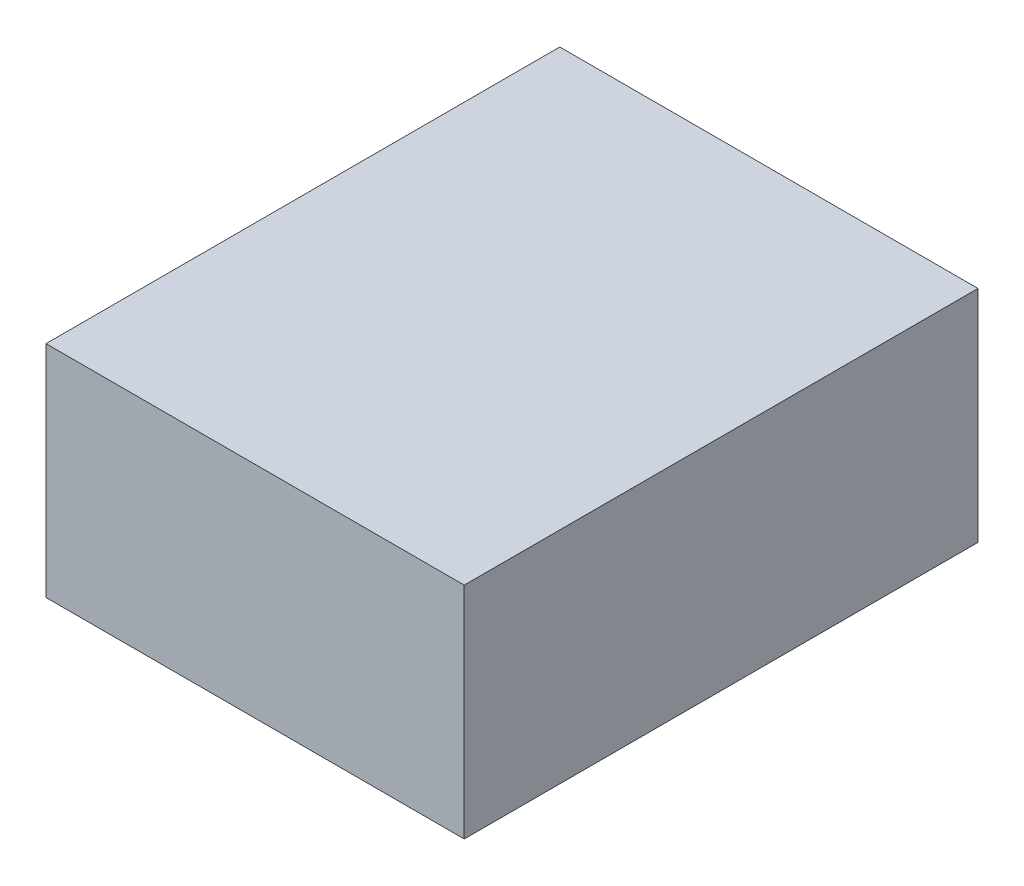
ISO-10303-21;
HEADER;
FILE_DESCRIPTION(('STEP AP214'),'2;1');
FILE_NAME('part.step','',(''),(''),'','','');
FILE_SCHEMA(('AUTOMOTIVE_DESIGN { 1 0 10303 214 1 1 1 1 }'));
ENDSEC;
DATA;
#1=APPLICATION_CONTEXT('core data for automotive mechanical design processes');
#2=APPLICATION_PROTOCOL_DEFINITION('international standard','automotive_design',2000,#1);
#3=PRODUCT_CONTEXT('',#1,'mechanical');
#4=PRODUCT('Part','Part','',(#3));
#5=PRODUCT_RELATED_PRODUCT_CATEGORY('part','',(#4));
#6=PRODUCT_DEFINITION_FORMATION('','',#4);
#7=PRODUCT_DEFINITION_CONTEXT('part definition',#1,'design');
#8=PRODUCT_DEFINITION('design','',#6,#7);
#9=PRODUCT_DEFINITION_SHAPE('','',#8);
#10=(LENGTH_UNIT() NAMED_UNIT(*) SI_UNIT(.MILLI.,.METRE.));
#11=(NAMED_UNIT(*) PLANE_ANGLE_UNIT() SI_UNIT($,.RADIAN.));
#12=(NAMED_UNIT(*) SI_UNIT($,.STERADIAN.) SOLID_ANGLE_UNIT());
#13=UNCERTAINTY_MEASURE_WITH_UNIT(LENGTH_MEASURE(1.E-05),#10,'distance_accuracy_value','');
#14=(GEOMETRIC_REPRESENTATION_CONTEXT(3) GLOBAL_UNCERTAINTY_ASSIGNED_CONTEXT((#13)) GLOBAL_UNIT_ASSIGNED_CONTEXT((#10,
#11,#12)) REPRESENTATION_CONTEXT('',''));
#15=CARTESIAN_POINT('',(0.,0.,0.));
#16=DIRECTION('',(0.,0.,1.));
#17=DIRECTION('',(1.,0.,0.));
#18=AXIS2_PLACEMENT_3D('',#15,#16,#17);
#19=CARTESIAN_POINT('',(0.,11.83,-27.64));
#20=DIRECTION('',(1.,0.,0.));
#21=DIRECTION('',(0.,0.,-1.));
#22=AXIS2_PLACEMENT_3D('',#19,#20,#21);
#23=PLANE('',#22);
#24=DIRECTION('',(0.,0.,1.));
#25=VECTOR('',#24,1.);
#26=CARTESIAN_POINT('',(0.,0.,-27.64));
#27=LINE('',#26,#25);
#28=CARTESIAN_POINT('',(0.,0.,-27.64));
#29=VERTEX_POINT('',#28);
#30=CARTESIAN_POINT('',(0.,0.,0.));
#31=VERTEX_POINT('',#30);
#32=EDGE_CURVE('E109',#29,#31,#27,.T.);
#33=ORIENTED_EDGE('',*,*,#32,.T.);
#34=DIRECTION('',(0.,-1.,0.));
#35=VECTOR('',#34,1.);
#36=CARTESIAN_POINT('',(0.,11.83,0.));
#37=LINE('',#36,#35);
#38=CARTESIAN_POINT('',(0.,11.83,0.));
#39=VERTEX_POINT('',#38);
#40=EDGE_CURVE('E11',#39,#31,#37,.T.);
#41=ORIENTED_EDGE('',*,*,#40,.F.);
#42=DIRECTION('',(0.,0.,1.));
#43=VECTOR('',#42,1.);
#44=CARTESIAN_POINT('',(0.,11.83,-27.64));
#45=LINE('',#44,#43);
#46=CARTESIAN_POINT('',(0.,11.83,-27.64));
#47=VERTEX_POINT('',#46);
#48=EDGE_CURVE('E93',#47,#39,#45,.T.);
#49=ORIENTED_EDGE('',*,*,#48,.F.);
#50=DIRECTION('',(0.,-1.,0.));
#51=VECTOR('',#50,1.);
#52=CARTESIAN_POINT('',(0.,11.83,-27.64));
#53=LINE('',#52,#51);
#54=EDGE_CURVE('E105',#47,#29,#53,.T.);
#55=ORIENTED_EDGE('',*,*,#54,.T.);
#56=EDGE_LOOP('',(#33,#41,#49,#55));
#57=FACE_BOUND('',#56,.T.);
#58=ADVANCED_FACE('F41',(#57),#23,.F.);
#59=CARTESIAN_POINT('',(0.,11.83,0.));
#60=DIRECTION('',(0.,0.,-1.));
#61=DIRECTION('',(-1.,0.,0.));
#62=AXIS2_PLACEMENT_3D('',#59,#60,#61);
#63=PLANE('',#62);
#64=DIRECTION('',(1.,0.,0.));
#65=VECTOR('',#64,1.);
#66=CARTESIAN_POINT('',(0.,0.,0.));
#67=LINE('',#66,#65);
#68=CARTESIAN_POINT('',(22.5,0.,0.));
#69=VERTEX_POINT('',#68);
#70=EDGE_CURVE('E98',#31,#69,#67,.T.);
#71=ORIENTED_EDGE('',*,*,#70,.T.);
#72=DIRECTION('',(0.,-1.,0.));
#73=VECTOR('',#72,1.);
#74=CARTESIAN_POINT('',(22.5,11.83,0.));
#75=LINE('',#74,#73);
#76=CARTESIAN_POINT('',(22.5,11.83,0.));
#77=VERTEX_POINT('',#76);
#78=EDGE_CURVE('E50',#77,#69,#75,.T.);
#79=ORIENTED_EDGE('',*,*,#78,.F.);
#80=DIRECTION('',(1.,0.,0.));
#81=VECTOR('',#80,1.);
#82=CARTESIAN_POINT('',(0.,11.83,0.));
#83=LINE('',#82,#81);
#84=EDGE_CURVE('E88',#39,#77,#83,.T.);
#85=ORIENTED_EDGE('',*,*,#84,.F.);
#86=ORIENTED_EDGE('',*,*,#40,.T.);
#87=EDGE_LOOP('',(#71,#79,#85,#86));
#88=FACE_BOUND('',#87,.T.);
#89=ADVANCED_FACE('F97',(#88),#63,.F.);
#90=CARTESIAN_POINT('',(22.5,11.83,0.));
#91=DIRECTION('',(-1.,0.,0.));
#92=DIRECTION('',(0.,0.,1.));
#93=AXIS2_PLACEMENT_3D('',#90,#91,#92);
#94=PLANE('',#93);
#95=DIRECTION('',(0.,0.,-1.));
#96=VECTOR('',#95,1.);
#97=CARTESIAN_POINT('',(22.5,0.,0.));
#98=LINE('',#97,#96);
#99=CARTESIAN_POINT('',(22.5,0.,-27.64));
#100=VERTEX_POINT('',#99);
#101=EDGE_CURVE('E75',#69,#100,#98,.T.);
#102=ORIENTED_EDGE('',*,*,#101,.T.);
#103=DIRECTION('',(0.,-1.,0.));
#104=VECTOR('',#103,1.);
#105=CARTESIAN_POINT('',(22.5,11.83,-27.64));
#106=LINE('',#105,#104);
#107=CARTESIAN_POINT('',(22.5,11.83,-27.64));
#108=VERTEX_POINT('',#107);
#109=EDGE_CURVE('E100',#108,#100,#106,.T.);
#110=ORIENTED_EDGE('',*,*,#109,.F.);
#111=DIRECTION('',(0.,0.,-1.));
#112=VECTOR('',#111,1.);
#113=CARTESIAN_POINT('',(22.5,11.83,0.));
#114=LINE('',#113,#112);
#115=EDGE_CURVE('E91',#77,#108,#114,.T.);
#116=ORIENTED_EDGE('',*,*,#115,.F.);
#117=ORIENTED_EDGE('',*,*,#78,.T.);
#118=EDGE_LOOP('',(#102,#110,#116,#117));
#119=FACE_BOUND('',#118,.T.);
#120=ADVANCED_FACE('F101',(#119),#94,.F.);
#121=CARTESIAN_POINT('',(22.5,11.83,-27.64));
#122=DIRECTION('',(0.,0.,1.));
#123=DIRECTION('',(1.,0.,0.));
#124=AXIS2_PLACEMENT_3D('',#121,#122,#123);
#125=PLANE('',#124);
#126=DIRECTION('',(-1.,0.,0.));
#127=VECTOR('',#126,1.);
#128=CARTESIAN_POINT('',(22.5,0.,-27.64));
#129=LINE('',#128,#127);
#130=EDGE_CURVE('E81',#100,#29,#129,.T.);
#131=ORIENTED_EDGE('',*,*,#130,.T.);
#132=ORIENTED_EDGE('',*,*,#54,.F.);
#133=DIRECTION('',(-1.,0.,0.));
#134=VECTOR('',#133,1.);
#135=CARTESIAN_POINT('',(22.5,11.83,-27.64));
#136=LINE('',#135,#134);
#137=EDGE_CURVE('E58',#108,#47,#136,.T.);
#138=ORIENTED_EDGE('',*,*,#137,.F.);
#139=ORIENTED_EDGE('',*,*,#109,.T.);
#140=EDGE_LOOP('',(#131,#132,#138,#139));
#141=FACE_BOUND('',#140,.T.);
#142=ADVANCED_FACE('F122',(#141),#125,.F.);
#143=CARTESIAN_POINT('',(0.,11.83,0.));
#144=DIRECTION('',(0.,1.,0.));
#145=DIRECTION('',(0.,0.,1.));
#146=AXIS2_PLACEMENT_3D('',#143,#144,#145);
#147=PLANE('',#146);
#148=ORIENTED_EDGE('',*,*,#48,.T.);
#149=ORIENTED_EDGE('',*,*,#84,.T.);
#150=ORIENTED_EDGE('',*,*,#115,.T.);
#151=ORIENTED_EDGE('',*,*,#137,.T.);
#152=EDGE_LOOP('',(#148,#149,#150,#151));
#153=FACE_BOUND('',#152,.T.);
#154=ADVANCED_FACE('F89',(#153),#147,.T.);
#155=CARTESIAN_POINT('',(0.,0.,0.));
#156=DIRECTION('',(0.,1.,0.));
#157=DIRECTION('',(0.,0.,1.));
#158=AXIS2_PLACEMENT_3D('',#155,#156,#157);
#159=PLANE('',#158);
#160=ORIENTED_EDGE('',*,*,#32,.F.);
#161=ORIENTED_EDGE('',*,*,#130,.F.);
#162=ORIENTED_EDGE('',*,*,#101,.F.);
#163=ORIENTED_EDGE('',*,*,#70,.F.);
#164=EDGE_LOOP('',(#160,#161,#162,#163));
#165=FACE_BOUND('',#164,.T.);
#166=ADVANCED_FACE('F125',(#165),#159,.F.);
#167=CLOSED_SHELL('',(#58,#89,#120,#142,#154,#166));
#168=MANIFOLD_SOLID_BREP('B2',#167);
#169=ADVANCED_BREP_SHAPE_REPRESENTATION('',(#18,#168),#14);
#170=SHAPE_DEFINITION_REPRESENTATION(#9,#169);
ENDSEC;
END-ISO-10303-21;
